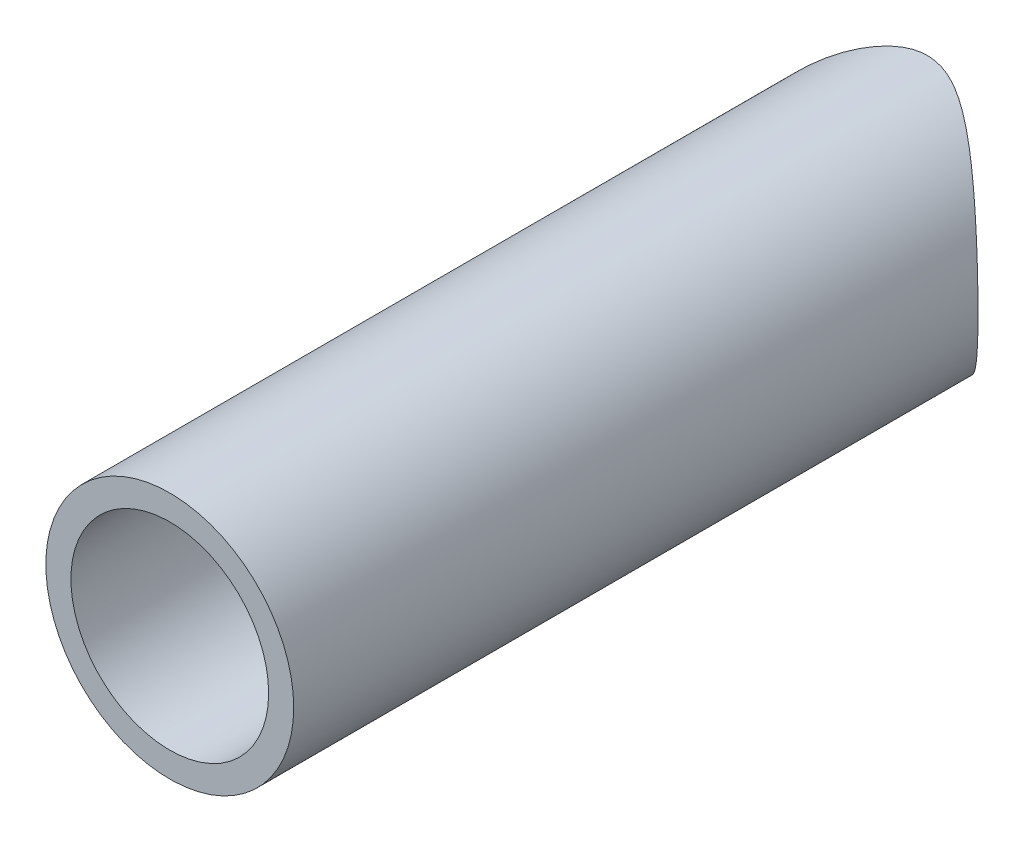
ISO-10303-21;
HEADER;
FILE_DESCRIPTION(('STEP AP214'),'2;1');
FILE_NAME('part.step','',(''),(''),'','','');
FILE_SCHEMA(('AUTOMOTIVE_DESIGN { 1 0 10303 214 1 1 1 1 }'));
ENDSEC;
DATA;
#1=APPLICATION_CONTEXT('core data for automotive mechanical design processes');
#2=APPLICATION_PROTOCOL_DEFINITION('international standard','automotive_design',2000,#1);
#3=PRODUCT_CONTEXT('',#1,'mechanical');
#4=PRODUCT('Part','Part','',(#3));
#5=PRODUCT_RELATED_PRODUCT_CATEGORY('part','',(#4));
#6=PRODUCT_DEFINITION_FORMATION('','',#4);
#7=PRODUCT_DEFINITION_CONTEXT('part definition',#1,'design');
#8=PRODUCT_DEFINITION('design','',#6,#7);
#9=PRODUCT_DEFINITION_SHAPE('','',#8);
#10=(LENGTH_UNIT() NAMED_UNIT(*) SI_UNIT(.MILLI.,.METRE.));
#11=(NAMED_UNIT(*) PLANE_ANGLE_UNIT() SI_UNIT($,.RADIAN.));
#12=(NAMED_UNIT(*) SI_UNIT($,.STERADIAN.) SOLID_ANGLE_UNIT());
#13=UNCERTAINTY_MEASURE_WITH_UNIT(LENGTH_MEASURE(1.E-05),#10,'distance_accuracy_value','');
#14=(GEOMETRIC_REPRESENTATION_CONTEXT(3) GLOBAL_UNCERTAINTY_ASSIGNED_CONTEXT((#13)) GLOBAL_UNIT_ASSIGNED_CONTEXT((#10,
#11,#12)) REPRESENTATION_CONTEXT('',''));
#15=CARTESIAN_POINT('',(0.,0.,0.));
#16=DIRECTION('',(0.,0.,1.));
#17=DIRECTION('',(1.,0.,0.));
#18=AXIS2_PLACEMENT_3D('',#15,#16,#17);
#19=CARTESIAN_POINT('',(-1.42108555E-13,0.,0.));
#20=DIRECTION('',(-1.,0.,0.));
#21=DIRECTION('',(0.,0.,1.));
#22=AXIS2_PLACEMENT_3D('',#19,#20,#21);
#23=CYLINDRICAL_SURFACE('',#22,19.05);
#24=CARTESIAN_POINT('',(0.,-16.7005,9.16492224462366));
#25=CARTESIAN_POINT('',(-0.267334143513812,-16.7004969713397,9.16493171258329));
#26=CARTESIAN_POINT('',(-0.534760521150864,-16.6940594806178,9.17668870782665));
#27=CARTESIAN_POINT('',(-1.06712538014874,-16.6685058090113,9.22301882354344));
#28=CARTESIAN_POINT('',(-1.33206190918598,-16.6493804040792,9.25760854319756));
#29=CARTESIAN_POINT('',(-1.85795059910665,-16.5989371757088,9.34775030823759));
#30=CARTESIAN_POINT('',(-2.11888827113559,-16.5675826196982,9.40336549198863));
#31=CARTESIAN_POINT('',(-2.63458598543975,-16.4934410116738,9.5328093194584));
#32=CARTESIAN_POINT('',(-2.88934310047885,-16.4506486534959,9.60664641536692));
#33=CARTESIAN_POINT('',(-3.50369164038948,-16.3330191299805,9.8057943483614));
#34=CARTESIAN_POINT('',(-3.85948704124683,-16.2523959333377,9.93938952452206));
#35=CARTESIAN_POINT('',(-4.5560548404136,-16.0710546260535,10.2300066984114));
#36=CARTESIAN_POINT('',(-4.89681770500833,-15.9703239806617,10.3870432937713));
#37=CARTESIAN_POINT('',(-5.56488891938311,-15.7500085594273,10.7181812721493));
#38=CARTESIAN_POINT('',(-5.89215445587848,-15.6303688552144,10.8923317934382));
#39=CARTESIAN_POINT('',(-6.53313217210747,-15.3734866020983,11.2519890768331));
#40=CARTESIAN_POINT('',(-6.84684566013471,-15.2362457574814,11.4374947385336));
#41=CARTESIAN_POINT('',(-7.39982875596399,-14.9740797599377,11.7777700314269));
#42=CARTESIAN_POINT('',(-7.64138221710308,-14.8522279894587,11.9312187254284));
#43=CARTESIAN_POINT('',(-8.1168032999471,-14.5978380581598,12.2411541370664));
#44=CARTESIAN_POINT('',(-8.35067014494468,-14.465298822051,12.39764115919));
#45=CARTESIAN_POINT('',(-9.04131486324777,-14.0516778671889,12.8696415721536));
#46=CARTESIAN_POINT('',(-9.48700758297317,-13.7546544723884,13.1876129782373));
#47=CARTESIAN_POINT('',(-10.3486324689901,-13.1186442693846,13.82045645139));
#48=CARTESIAN_POINT('',(-10.7645953899587,-12.7797018464993,14.1353314219882));
#49=CARTESIAN_POINT('',(-11.5659953881062,-12.0592094958907,14.7547790562651));
#50=CARTESIAN_POINT('',(-11.9514461873923,-11.6776789093992,15.0593563153826));
#51=CARTESIAN_POINT('',(-12.6037051376366,-10.9649221128724,15.5827057401072));
#52=CARTESIAN_POINT('',(-12.8773206259585,-10.6425001835016,15.8050176411876));
#53=CARTESIAN_POINT('',(-13.4031359250787,-9.9721646081207,16.2362931237103));
#54=CARTESIAN_POINT('',(-13.6553362938992,-9.62425162678145,16.4452570529308));
#55=CARTESIAN_POINT('',(-14.1356722307146,-8.90374466422381,16.8462336575498));
#56=CARTESIAN_POINT('',(-14.3638404428801,-8.53118531213244,17.0382692681927));
#57=CARTESIAN_POINT('',(-14.7937679756363,-7.76177857900515,17.4022494225294));
#58=CARTESIAN_POINT('',(-14.9955326569384,-7.36493615225123,17.5741980437234));
#59=CARTESIAN_POINT('',(-15.3345046593532,-6.62515786515105,17.8643971050048));
#60=CARTESIAN_POINT('',(-15.4767206347819,-6.286087835233,17.9866683996884));
#61=CARTESIAN_POINT('',(-15.7400317806347,-5.59419707966774,18.2137298076118));
#62=CARTESIAN_POINT('',(-15.8611312908755,-5.24137919773268,18.3185235126201));
#63=CARTESIAN_POINT('',(-16.0805178447426,-4.52375529099961,18.5088053133987));
#64=CARTESIAN_POINT('',(-16.1788127560741,-4.15895345046511,18.5943000671316));
#65=CARTESIAN_POINT('',(-16.3511008978489,-3.41940512301331,18.7443994459972));
#66=CARTESIAN_POINT('',(-16.4250938603572,-3.04465852650187,18.8090038408086));
#67=CARTESIAN_POINT('',(-16.5478177121131,-2.28581119925894,18.9162674839082));
#68=CARTESIAN_POINT('',(-16.5964102006374,-1.90167091887679,18.9588064940739));
#69=CARTESIAN_POINT('',(-16.666804707323,-1.12906083878382,19.0204597575691));
#70=CARTESIAN_POINT('',(-16.6886066647097,-0.74059102925346,19.0395739577594));
#71=CARTESIAN_POINT('',(-16.7049882251047,0.0372978163732662,19.0539343955931));
#72=CARTESIAN_POINT('',(-16.6995724752064,0.426716679082538,19.049184707706));
#73=CARTESIAN_POINT('',(-16.6616355145164,1.2031920509291,19.0159357772426));
#74=CARTESIAN_POINT('',(-16.6291157684196,1.59024868658218,18.9874378180186));
#75=CARTESIAN_POINT('',(-16.5415552070959,2.32567865984817,18.9108023421566));
#76=CARTESIAN_POINT('',(-16.488693223795,2.67451459724518,18.8645659111558));
#77=CARTESIAN_POINT('',(-16.3616909650143,3.36527510512395,18.7536602611724));
#78=CARTESIAN_POINT('',(-16.2875521815503,3.70720015842598,18.6889923346835));
#79=CARTESIAN_POINT('',(-16.1190414789457,4.38226758281246,18.5423185700096));
#80=CARTESIAN_POINT('',(-16.0246660698939,4.71540842787238,18.46030974133));
#81=CARTESIAN_POINT('',(-15.8169106363278,5.37125573153289,18.2802564782909));
#82=CARTESIAN_POINT('',(-15.7035294347893,5.69396154241695,18.182211050798));
#83=CARTESIAN_POINT('',(-15.450819750521,6.34903861621961,17.9643884341261));
#84=CARTESIAN_POINT('',(-15.3102569210811,6.68059356551892,17.8435914710632));
#85=CARTESIAN_POINT('',(-15.0105687207739,7.329200629877,17.5871249569696));
#86=CARTESIAN_POINT('',(-14.8514430464951,7.6462525077637,17.4514551628432));
#87=CARTESIAN_POINT('',(-14.5161859035024,8.26503816448766,17.1670489808401));
#88=CARTESIAN_POINT('',(-14.3400568632683,8.56677412143307,17.0183144591857));
#89=CARTESIAN_POINT('',(-13.9721688765162,9.15453154930369,16.7094978823359));
#90=CARTESIAN_POINT('',(-13.7804066955943,9.44054974772174,16.549413479815));
#91=CARTESIAN_POINT('',(-13.2797925036004,10.1401439624792,16.1344390292778));
#92=CARTESIAN_POINT('',(-12.9615928917062,10.5433589550976,15.8732639569844));
#93=CARTESIAN_POINT('',(-12.2957493768357,11.3128406850839,15.334371926415));
#94=CARTESIAN_POINT('',(-11.9480920605743,11.6790904225519,15.0566474497901));
#95=CARTESIAN_POINT('',(-11.2241657385922,12.3765383549121,14.4888552244966));
#96=CARTESIAN_POINT('',(-10.8477622427781,12.7075519462558,14.1987326557412));
#97=CARTESIAN_POINT('',(-10.0694893547772,13.3327127718377,13.6133980326449));
#98=CARTESIAN_POINT('',(-9.66762628498831,13.6268691052601,13.3181872550159));
#99=CARTESIAN_POINT('',(-8.82886911504135,14.1851175017329,12.7222327858003));
#100=CARTESIAN_POINT('',(-8.39137729391606,14.4483502704712,12.4215202757343));
#101=CARTESIAN_POINT('',(-7.71423447868457,14.8142868478741,11.978160080526));
#102=CARTESIAN_POINT('',(-7.4848946856878,14.9315074903397,11.8315739941533));
#103=CARTESIAN_POINT('',(-7.01897178437125,15.1561088727815,11.5424573570132));
#104=CARTESIAN_POINT('',(-6.78238972084811,15.263491023253,11.3999262269336));
#105=CARTESIAN_POINT('',(-6.3031860852116,15.467511398442,11.1215189175592));
#106=CARTESIAN_POINT('',(-6.06061486641165,15.5642160457498,10.9856049269084));
#107=CARTESIAN_POINT('',(-5.56747089335448,15.7473540612849,10.7214348860791));
#108=CARTESIAN_POINT('',(-5.31689704311532,15.8337860149196,10.5931798917832));
#109=CARTESIAN_POINT('',(-4.80783032456403,15.9957081213771,10.3470517951479));
#110=CARTESIAN_POINT('',(-4.54935285365322,16.0712180881296,10.2291600489364));
#111=CARTESIAN_POINT('',(-4.02385429135118,16.2107725612406,10.0065282200569));
#112=CARTESIAN_POINT('',(-3.75683726329165,16.2748224276667,9.90178199590471));
#113=CARTESIAN_POINT('',(-3.25302839587754,16.3823385341132,9.72269482971668));
#114=CARTESIAN_POINT('',(-3.017374342503,16.4274384650467,9.64614789023986));
#115=CARTESIAN_POINT('',(-2.54015715607399,16.5079626202915,9.50768607055383));
#116=CARTESIAN_POINT('',(-2.29859466535356,16.5433878913312,9.44576960753026));
#117=CARTESIAN_POINT('',(-1.81109459221824,16.6038179609703,9.33913774128664));
#118=CARTESIAN_POINT('',(-1.56517128179642,16.6288518871565,9.29437428459953));
#119=CARTESIAN_POINT('',(-1.06972288808643,16.6680568840186,9.22388336313559));
#120=CARTESIAN_POINT('',(-0.820197958666611,16.6822284173665,9.19815508757753));
#121=CARTESIAN_POINT('',(-0.317697960509029,16.6993832396358,9.16697500651445));
#122=CARTESIAN_POINT('',(-0.064710973856701,16.7022864368161,9.16166835365168));
#123=CARTESIAN_POINT('',(0.440691090104184,16.6965973761502,9.17203176520293));
#124=CARTESIAN_POINT('',(0.693106174235391,16.6880052561712,9.18770157803913));
#125=CARTESIAN_POINT('',(1.19569135625681,16.6595470554227,9.23920143813596));
#126=CARTESIAN_POINT('',(1.44585618089403,16.6396592471854,9.27507033758286));
#127=CARTESIAN_POINT('',(1.9417283857023,16.5891094904821,9.36517988059043));
#128=CARTESIAN_POINT('',(2.18743496046977,16.5584456152532,9.41942380954735));
#129=CARTESIAN_POINT('',(2.75390499349109,16.4751221377221,9.56462109831966));
#130=CARTESIAN_POINT('',(3.0724977792427,16.4185397230908,9.66178305936684));
#131=CARTESIAN_POINT('',(3.6984342588225,16.2889713478626,9.87865499878587));
#132=CARTESIAN_POINT('',(4.00577286211501,16.2159780682651,9.9983750338525));
#133=CARTESIAN_POINT('',(4.60990982401467,16.0547023351078,10.2553452780955));
#134=CARTESIAN_POINT('',(4.90667483105957,15.9663759154979,10.3926455912197));
#135=CARTESIAN_POINT('',(5.48919004687079,15.7755962103843,10.6800192987644));
#136=CARTESIAN_POINT('',(5.77494044142326,15.6731431632914,10.8300924776048));
#137=CARTESIAN_POINT('',(6.29917979834937,15.4691752125086,11.1190902170746));
#138=CARTESIAN_POINT('',(6.53894133190319,15.369309556088,11.2568846623541));
#139=CARTESIAN_POINT('',(7.01109564172073,15.1597470786916,11.5375598584046));
#140=CARTESIAN_POINT('',(7.2434873662306,15.0500488629716,11.6804413290297));
#141=CARTESIAN_POINT('',(7.93034916355095,14.706418450573,12.1144412707242));
#142=CARTESIAN_POINT('',(8.37434792805997,14.458012420242,12.4108257765464));
#143=CARTESIAN_POINT('',(9.23646923233411,13.9230714223544,13.0081451122874));
#144=CARTESIAN_POINT('',(9.65455508965203,13.6364841335111,13.3090856747979));
#145=CARTESIAN_POINT('',(10.4643689379054,13.0253930888848,13.9077161762095));
#146=CARTESIAN_POINT('',(10.8561033915344,12.7008986836573,14.2054068970222));
#147=CARTESIAN_POINT('',(11.6261157150575,12.0008618634111,14.8020628991056));
#148=CARTESIAN_POINT('',(12.0033666977648,11.6238795658078,15.1006713624391));
#149=CARTESIAN_POINT('',(12.7258044391788,10.8281781550468,15.681061925244));
#150=CARTESIAN_POINT('',(13.070983602633,10.4094492038662,15.9628400333343));
#151=CARTESIAN_POINT('',(13.724151830647,9.53165214803921,16.5019482957775));
#152=CARTESIAN_POINT('',(14.0322593223495,9.07272105460881,16.7593557096517));
#153=CARTESIAN_POINT('',(14.4633053136647,8.35448695148135,17.1224137504313));
#154=CARTESIAN_POINT('',(14.6017752870601,8.11015781906637,17.2395684455245));
#155=CARTESIAN_POINT('',(14.8677152846243,7.61167179592308,17.465389032482));
#156=CARTESIAN_POINT('',(14.9951829759962,7.3575128374535,17.5740531236363));
#157=CARTESIAN_POINT('',(15.2710980163437,6.76994194580124,17.8099923433337));
#158=CARTESIAN_POINT('',(15.4159255874011,6.43365007281853,17.9343776295871));
#159=CARTESIAN_POINT('',(15.6847682484996,5.74722197906865,18.1659874111414));
#160=CARTESIAN_POINT('',(15.8087895010181,5.39708989563437,18.2732169872342));
#161=CARTESIAN_POINT('',(16.0343443294884,4.68465742067921,18.4686987374566));
#162=CARTESIAN_POINT('',(16.1358889538978,4.32236310885614,18.5569602347818));
#163=CARTESIAN_POINT('',(16.315006660328,3.58751519829674,18.712918020525));
#164=CARTESIAN_POINT('',(16.3925788998939,3.21496123950949,18.7806135861987));
#165=CARTESIAN_POINT('',(16.5227859988325,2.4600329406762,18.8943707584114));
#166=CARTESIAN_POINT('',(16.5752782963087,2.07761518489369,18.9403086754329));
#167=CARTESIAN_POINT('',(16.6536928743376,1.30798312864007,19.0089696320617));
#168=CARTESIAN_POINT('',(16.6796152692096,0.920768848813674,19.0316927715525));
#169=CARTESIAN_POINT('',(16.7043812301211,0.144866523765919,19.0534017047831));
#170=CARTESIAN_POINT('',(16.703228891697,-0.243821289663468,19.0523910886768));
#171=CARTESIAN_POINT('',(16.673876335199,-1.01936819512169,19.0266628954678));
#172=CARTESIAN_POINT('',(16.6456775469154,-1.40622738273306,19.0019465715496));
#173=CARTESIAN_POINT('',(16.5662492256478,-2.14282170166587,18.9324082421113));
#174=CARTESIAN_POINT('',(16.5171347749374,-2.4929639539686,18.8894333762072));
#175=CARTESIAN_POINT('',(16.3974255377654,-3.1866945236683,18.7848480313874));
#176=CARTESIAN_POINT('',(16.3268321958921,-3.53028328017742,18.7232388057493));
#177=CARTESIAN_POINT('',(16.1651783563708,-4.208970642905,18.5824437203587));
#178=CARTESIAN_POINT('',(16.0741145606462,-4.54406787132817,18.5032550283336));
#179=CARTESIAN_POINT('',(15.8727288325233,-5.20406006253607,18.3285790529043));
#180=CARTESIAN_POINT('',(15.7624057607375,-5.52895442037182,18.2330908052185));
#181=CARTESIAN_POINT('',(15.5166116002092,-6.18643270750094,18.0210139635634));
#182=CARTESIAN_POINT('',(15.3800258596851,-6.51830064376362,17.903500731655));
#183=CARTESIAN_POINT('',(15.0882485289239,-7.16786232403991,17.6534809065475));
#184=CARTESIAN_POINT('',(14.9330567182975,-7.48555590009691,17.5209741357508));
#185=CARTESIAN_POINT('',(14.6055992998661,-8.10593542179799,17.2427339282642));
#186=CARTESIAN_POINT('',(14.433334858401,-8.40862239052236,17.0970013951676));
#187=CARTESIAN_POINT('',(14.073117885155,-8.99852996119753,16.794015807398));
#188=CARTESIAN_POINT('',(13.8851621005975,-9.28574733593744,16.6367603648848));
#189=CARTESIAN_POINT('',(13.3948553657084,-9.9874958280873,16.2293224719705));
#190=CARTESIAN_POINT('',(13.083213077385,-10.3919032356858,15.9727915114827));
#191=CARTESIAN_POINT('',(12.4305754806713,-11.1643811052831,15.4427556832551));
#192=CARTESIAN_POINT('',(12.0895669830621,-11.5324350788893,15.1692432041716));
#193=CARTESIAN_POINT('',(11.3793336820004,-12.2338752711684,14.6094823534446));
#194=CARTESIAN_POINT('',(11.0099897348343,-12.567099426554,14.3231825867058));
#195=CARTESIAN_POINT('',(10.2461250239018,-13.1973021064863,13.7446925323015));
#196=CARTESIAN_POINT('',(9.85161008828557,-13.4942889754515,13.4525036188645));
#197=CARTESIAN_POINT('',(9.02853185242813,-14.0586994442566,12.8618063908295));
#198=CARTESIAN_POINT('',(8.59939903498759,-14.3252991664271,12.5633051486633));
#199=CARTESIAN_POINT('',(7.7138226202617,-14.8209801943336,11.9745105441563));
#200=CARTESIAN_POINT('',(7.25735840874405,-15.0500326814112,11.6842236266356));
#201=CARTESIAN_POINT('',(6.55204064605885,-15.3636931423819,11.2645419394328));
#202=CARTESIAN_POINT('',(6.31414073695103,-15.4630411759273,11.1276074698839));
#203=CARTESIAN_POINT('',(5.83060990517612,-15.6517757583158,10.8605294940374));
#204=CARTESIAN_POINT('',(5.58497805823002,-15.741161110372,10.7303868046124));
#205=CARTESIAN_POINT('',(5.0860151658861,-15.9093792453499,10.4793584841729));
#206=CARTESIAN_POINT('',(4.83269714023912,-15.9882287709039,10.358458299818));
#207=CARTESIAN_POINT('',(4.3177229260104,-16.1349188587204,10.1284493823784));
#208=CARTESIAN_POINT('',(4.05607013110744,-16.202763834869,10.0193359275729));
#209=CARTESIAN_POINT('',(3.55088725229858,-16.3204855569409,9.82627788539519));
#210=CARTESIAN_POINT('',(3.3081672600192,-16.3714814235504,9.74090697898469));
#211=CARTESIAN_POINT('',(2.81604949033619,-16.4632680074043,9.58496246650375));
#212=CARTESIAN_POINT('',(2.56665131083892,-16.5040581086231,9.51438975370186));
#213=CARTESIAN_POINT('',(2.06294009009423,-16.57454049378,9.39106751249732));
#214=CARTESIAN_POINT('',(1.80864978682487,-16.6042750874025,9.33825011013253));
#215=CARTESIAN_POINT('',(1.29573530587421,-16.6521467637266,9.25261877015366));
#216=CARTESIAN_POINT('',(1.03711438199104,-16.6702921851168,9.21979045070778));
#217=CARTESIAN_POINT('',(0.648205600149655,-16.6884176100347,9.1869118266478));
#218=CARTESIAN_POINT('',(0.518770543150936,-16.6929438825602,9.1786799878668));
#219=CARTESIAN_POINT('',(0.259564292009351,-16.6989862187004,9.16768216137718));
#220=CARTESIAN_POINT('',(0.129793016652383,-16.7005014704405,9.16491764784816));
#221=CARTESIAN_POINT('',(0.,-16.7005,9.16492224462366));
#222=B_SPLINE_CURVE_WITH_KNOTS('',3,(#24,#25,#26,#27,#28,#29,#30,#31,#32,#33,#34,#35,#36,#37,
#38,#39,#40,#41,#42,#43,#44,#45,#46,#47,#48,#49,#50,#51,#52,#53,#54,#55,#56,#57,#58,#59,#60,#61,
#62,#63,#64,#65,#66,#67,#68,#69,#70,#71,#72,#73,#74,#75,#76,#77,#78,#79,#80,#81,#82,#83,#84,#85,
#86,#87,#88,#89,#90,#91,#92,#93,#94,#95,#96,#97,#98,#99,#100,#101,#102,#103,#104,#105,#106,#107,
#108,#109,#110,#111,#112,#113,#114,#115,#116,#117,#118,#119,#120,#121,#122,#123,#124,#125,#126,
#127,#128,#129,#130,#131,#132,#133,#134,#135,#136,#137,#138,#139,#140,#141,#142,#143,#144,#145,
#146,#147,#148,#149,#150,#151,#152,#153,#154,#155,#156,#157,#158,#159,#160,#161,#162,#163,#164,
#165,#166,#167,#168,#169,#170,#171,#172,#173,#174,#175,#176,#177,#178,#179,#180,#181,#182,#183,
#184,#185,#186,#187,#188,#189,#190,#191,#192,#193,#194,#195,#196,#197,#198,#199,#200,#201,#202,
#203,#204,#205,#206,#207,#208,#209,#210,#211,#212,#213,#214,#215,#216,#217,#218,#219,#220,#221),
.UNSPECIFIED.,.T.,.F.,(4,2,2,2,2,2,2,2,2,2,2,2,2,2,2,2,2,2,2,2,2,2,2,2,2,2,2,2,2,2,2,2,2,2,2,2,
2,2,2,2,2,2,2,2,2,2,2,2,2,2,2,2,2,2,2,2,2,2,2,2,2,2,2,2,2,2,2,2,2,2,2,2,2,2,2,2,2,2,2,2,2,2,2,2,
2,2,2,2,2,2,2,2,2,2,2,2,2,2,4),(0.,0.801837429596003,1.60425843057712,2.40910845045848,
3.21433250208412,4.37787474462989,5.54214460393507,6.70986087456664,7.87746416261185,
8.81026563612272,9.74316107818136,11.6094445513692,13.4737685905699,15.3372493735002,
16.7692951064365,18.2013035125269,19.631340953316,21.0610876015194,22.2224283636906,
23.3835301672392,24.5442307869359,25.7049442032107,26.8719178064824,28.0388940570331,
29.2056710673079,30.3723850292556,31.4386991828291,32.5049385803792,33.5713620045441,
34.6378514964658,35.7762787737258,36.9147246612977,38.0530081919524,39.1915278273071,
40.9177055603248,42.6446735598335,44.380284856342,46.115466823728,47.8910429391808,
48.7798793209016,49.6685880745535,50.5514132177893,51.4343597891945,52.3156839296451,
53.1965947773504,53.9515400178129,54.7064035462523,55.4591366186985,56.2118376275152,
56.9698789023383,57.7279110857986,58.4874063204878,59.2470374222229,60.2589246426935,
61.2712640481267,62.2865556726081,63.3018301644174,64.1835582212893,65.0654115494357,
66.8296916847058,68.5964148393902,70.3627031127071,72.1940401696108,74.0258098244316,
75.8515630299742,76.7640514971158,77.6767329649309,78.8356836946879,79.9942905546169,
81.1523266266567,82.3104033906068,83.4749869192756,84.6395654372018,85.8039677929887,
86.9683085969112,88.0356197984032,89.1028592324735,90.1702707371519,91.2377454117945,
92.369532140314,93.5013322761842,94.6330551448101,95.7650132021125,97.4766425845455,
99.1890447593569,100.909089839066,102.628738090723,104.387412653646,106.147430796405,
107.022914163103,107.898502585883,108.772682617086,109.646511146036,110.432807968525,
111.219152240871,112.002455399937,112.785194316669,113.174388331415,113.563687271999),.UNSPECIFIED.);
#223=CARTESIAN_POINT('',(0.,-16.7005,9.16492224462366));
#224=VERTEX_POINT('',#223);
#225=EDGE_CURVE('E28',#224,#224,#222,.F.);
#226=ORIENTED_EDGE('',*,*,#225,.F.);
#227=EDGE_LOOP('',(#226));
#228=FACE_BOUND('',#227,.T.);
#229=CARTESIAN_POINT('',(0.,-13.3223,13.6168580337021));
#230=CARTESIAN_POINT('',(0.31988652633806,-13.3222981478097,13.6168614502072));
#231=CARTESIAN_POINT('',(0.639797242992395,-13.3107525824012,13.628184894002));
#232=CARTESIAN_POINT('',(1.27642617969916,-13.2648527158155,13.6728627603449));
#233=CARTESIAN_POINT('',(1.59314397347371,-13.2304954089984,13.7062200860405));
#234=CARTESIAN_POINT('',(2.221130035707,-13.139677578582,13.7933067556177));
#235=CARTESIAN_POINT('',(2.53238675830178,-13.0831750230616,13.8470748331872));
#236=CARTESIAN_POINT('',(3.14662661666113,-12.94918015756,13.9724593784829));
#237=CARTESIAN_POINT('',(3.44960942648851,-12.8716870219986,14.0440765482227));
#238=CARTESIAN_POINT('',(4.04231678109167,-12.6979387684118,14.2013520959915));
#239=CARTESIAN_POINT('',(4.33215378434118,-12.6019098508723,14.2868393842577));
#240=CARTESIAN_POINT('',(4.90141144157906,-12.3916089572922,14.4696210652096));
#241=CARTESIAN_POINT('',(5.18082714154018,-12.2773284378767,14.5669209821165));
#242=CARTESIAN_POINT('',(5.72846372178175,-12.0315605128677,14.770562174833));
#243=CARTESIAN_POINT('',(5.9966867691101,-11.9000764586881,14.8769016882326));
#244=CARTESIAN_POINT('',(6.52154726452771,-11.6207340257021,15.0961107423294));
#245=CARTESIAN_POINT('',(6.77818782989793,-11.4728800900869,15.2089785071446));
#246=CARTESIAN_POINT('',(7.32357994083547,-11.1341436928368,15.4591420166459));
#247=CARTESIAN_POINT('',(7.61009442573397,-10.9402587925397,15.5972569013245));
#248=CARTESIAN_POINT('',(8.16639702208179,-10.5315139977905,15.8761123693525));
#249=CARTESIAN_POINT('',(8.43618388684849,-10.3166525430546,16.0168531473911));
#250=CARTESIAN_POINT('',(8.9587266433862,-9.86630553881672,16.2981310418589));
#251=CARTESIAN_POINT('',(9.21146225460457,-9.63079617033312,16.4386677277965));
#252=CARTESIAN_POINT('',(9.69874022973578,-9.13989777428,16.7165890023536));
#253=CARTESIAN_POINT('',(9.93328134055978,-8.88450737989011,16.8539733734094));
#254=CARTESIAN_POINT('',(10.420547416895,-8.31025065919657,17.1453314675352));
#255=CARTESIAN_POINT('',(10.6698050648036,-7.98789304111428,17.2982621580168));
#256=CARTESIAN_POINT('',(11.1400000535633,-7.31789376821127,17.5921790852614));
#257=CARTESIAN_POINT('',(11.3609321889448,-6.9702474843583,17.7331631249407));
#258=CARTESIAN_POINT('',(11.7715183015944,-6.25187201135312,17.9989730615405));
#259=CARTESIAN_POINT('',(11.9612225135273,-5.88118124283975,18.1238248385623));
#260=CARTESIAN_POINT('',(12.3068591127191,-5.11858800434073,18.3537720761174));
#261=CARTESIAN_POINT('',(12.4628061664871,-4.72669483906192,18.4588761138412));
#262=CARTESIAN_POINT('',(12.7010421193985,-4.03277849284508,18.6206841141411));
#263=CARTESIAN_POINT('',(12.7918624757773,-3.73491559390011,18.682803774284));
#264=CARTESIAN_POINT('',(12.9528661082313,-3.13120844518833,18.7934065558681));
#265=CARTESIAN_POINT('',(13.0230537383409,-2.82536589418578,18.8418925542676));
#266=CARTESIAN_POINT('',(13.14185187519,-2.20776667348627,18.9241977467945));
#267=CARTESIAN_POINT('',(13.1904758409694,-1.89601381980445,18.9580260892478));
#268=CARTESIAN_POINT('',(13.2655302565148,-1.26854784484051,19.0103232226469));
#269=CARTESIAN_POINT('',(13.2919599533497,-0.952834589572198,19.0287914925086));
#270=CARTESIAN_POINT('',(13.3222597332972,-0.31917956235475,19.0499687337098));
#271=CARTESIAN_POINT('',(13.326085857239,-0.00123465114232492,19.0526469968036));
#272=CARTESIAN_POINT('',(13.3110031436808,0.633847263309006,19.0421006894973));
#273=CARTESIAN_POINT('',(13.2920943914738,0.950984269574409,19.0288761787587));
#274=CARTESIAN_POINT('',(13.2318194226826,1.58213735553395,18.9868218272433));
#275=CARTESIAN_POINT('',(13.1904479713798,1.89615269037562,18.9579883489496));
#276=CARTESIAN_POINT('',(13.0858409365783,2.51874825818788,18.8853551821731));
#277=CARTESIAN_POINT('',(13.0226053344318,2.82732848652267,18.8415554809257));
#278=CARTESIAN_POINT('',(12.8768055570558,3.43008911577336,18.7410837784494));
#279=CARTESIAN_POINT('',(12.7947148536454,3.72443741904168,18.6847279728804));
#280=CARTESIAN_POINT('',(12.6114314596894,4.30441297595258,18.5597019641527));
#281=CARTESIAN_POINT('',(12.5102391907176,4.59004042190389,18.4910320327698));
#282=CARTESIAN_POINT('',(12.2897976043466,5.1512574450488,18.3426090562162));
#283=CARTESIAN_POINT('',(12.1705477348143,5.42684671499319,18.2628556721614));
#284=CARTESIAN_POINT('',(11.9150543034258,5.96694473566732,18.0935951500125));
#285=CARTESIAN_POINT('',(11.7788084781244,6.23145200426643,18.004086712985));
#286=CARTESIAN_POINT('',(11.4741859851383,6.77754721148407,17.8062035536039));
#287=CARTESIAN_POINT('',(11.3039194358879,7.05772235950273,17.6968388241989));
#288=CARTESIAN_POINT('',(10.944991629307,7.60245040810987,17.4697551881095));
#289=CARTESIAN_POINT('',(10.7563292067023,7.86700231734827,17.3520357523306));
#290=CARTESIAN_POINT('',(10.3616001265381,8.38008264984337,17.1101497579331));
#291=CARTESIAN_POINT('',(10.1555176216586,8.62859611231162,16.9859773693862));
#292=CARTESIAN_POINT('',(9.72707743344,9.10885362089824,16.7333476085061));
#293=CARTESIAN_POINT('',(9.5047183828671,9.34059625500394,16.6048898766973));
#294=CARTESIAN_POINT('',(9.00346439264899,9.82669756532139,16.3227118379899));
#295=CARTESIAN_POINT('',(8.72155934818149,10.0777180759097,16.1685721297418));
#296=CARTESIAN_POINT('',(8.13720269984174,10.5551889267503,15.860994658355));
#297=CARTESIAN_POINT('',(7.83474698021703,10.7816343215371,15.707557042433));
#298=CARTESIAN_POINT('',(7.21007593059627,11.2090003382942,15.4054946764291));
#299=CARTESIAN_POINT('',(6.88786284250592,11.4099238483628,15.2568693831976));
#300=CARTESIAN_POINT('',(6.22428542965587,11.78503846859,14.9690089852482));
#301=CARTESIAN_POINT('',(5.88292675135433,11.9592374043918,14.8297711383645));
#302=CARTESIAN_POINT('',(5.26307548585057,12.2421949467986,14.5964580040423));
#303=CARTESIAN_POINT('',(4.98835083038973,12.3567629109929,14.4993951864827));
#304=CARTESIAN_POINT('',(4.42859477658522,12.5682414944608,14.3164711963064));
#305=CARTESIAN_POINT('',(4.14356603439826,12.6651566258766,14.2306071628288));
#306=CARTESIAN_POINT('',(3.564456481461,12.8401584734866,14.0729067823872));
#307=CARTESIAN_POINT('',(3.27038997523824,12.9182733734509,14.0010494688273));
#308=CARTESIAN_POINT('',(2.67414582363414,13.0547357571211,13.87389979944));
#309=CARTESIAN_POINT('',(2.37196827122568,13.1130834673041,13.8186072538271));
#310=CARTESIAN_POINT('',(1.75828452487774,13.2094492865481,13.7265242677556));
#311=CARTESIAN_POINT('',(1.44671418662299,13.2472509936074,13.6899310102396));
#312=CARTESIAN_POINT('',(0.819905882256556,13.3007648009045,13.6379459191976));
#313=CARTESIAN_POINT('',(0.504668046343509,13.3164776829125,13.6225533353354));
#314=CARTESIAN_POINT('',(-0.126344914354952,13.3254363019074,13.6137903844871));
#315=CARTESIAN_POINT('',(-0.442119859527984,13.3186884682998,13.6204137154194));
#316=CARTESIAN_POINT('',(-1.07117640732708,13.2829025286525,13.6553146237379));
#317=CARTESIAN_POINT('',(-1.38445811269697,13.2538653459899,13.6835913040944));
#318=CARTESIAN_POINT('',(-1.96259612856432,13.1797080711553,13.754999611617));
#319=CARTESIAN_POINT('',(-2.22814427169565,13.1373760024855,13.7955280874475));
#320=CARTESIAN_POINT('',(-2.75394668833031,13.0372964660328,13.8901454855898));
#321=CARTESIAN_POINT('',(-3.01419902789,12.9795434717645,13.9442392689549));
#322=CARTESIAN_POINT('',(-3.52833131241545,12.849316471082,14.064330741592));
#323=CARTESIAN_POINT('',(-3.78220742405787,12.7768338366348,14.1303354052306));
#324=CARTESIAN_POINT('',(-4.28267719245013,12.6178968233818,14.2724400702245));
#325=CARTESIAN_POINT('',(-4.52926912728759,12.531439171781,14.3485424356008));
#326=CARTESIAN_POINT('',(-5.12885946301222,12.3014064883293,14.546839514453));
#327=CARTESIAN_POINT('',(-5.47731633977133,12.1501002866724,14.6738702927616));
#328=CARTESIAN_POINT('',(-6.15625428401588,11.8206056641701,14.9405730792039));
#329=CARTESIAN_POINT('',(-6.48672807120731,11.642406464486,15.080250147008));
#330=CARTESIAN_POINT('',(-7.12952942608352,11.2602624030576,15.3677014900798));
#331=CARTESIAN_POINT('',(-7.44182626542754,11.0562756934435,15.5154887007473));
#332=CARTESIAN_POINT('',(-8.04706937031913,10.6238723952442,15.8147072588469));
#333=CARTESIAN_POINT('',(-8.34001786540576,10.3954586293985,15.9661381836551));
#334=CARTESIAN_POINT('',(-8.91119855456929,9.9104589642748,16.2717237055127));
#335=CARTESIAN_POINT('',(-9.18905171047002,9.65342504933495,16.4258761204329));
#336=CARTESIAN_POINT('',(-9.72292999884347,9.11547627667314,16.7303954283831));
#337=CARTESIAN_POINT('',(-9.97895352424027,8.83455966376557,16.8807620421328));
#338=CARTESIAN_POINT('',(-10.4674069986125,8.24996698451183,17.1740312969632));
#339=CARTESIAN_POINT('',(-10.6998671383029,7.94632093076941,17.3169433722024));
#340=CARTESIAN_POINT('',(-11.1397523547335,7.31689398561751,17.5921424141232));
#341=CARTESIAN_POINT('',(-11.3471821958347,6.99111732514065,17.7244314012347));
#342=CARTESIAN_POINT('',(-11.7035635394989,6.37307961126929,17.9548565597905));
#343=CARTESIAN_POINT('',(-11.8565482817566,6.08390928578376,18.0550572371503));
#344=CARTESIAN_POINT('',(-12.1420544799472,5.49200427038381,18.2438163728699));
#345=CARTESIAN_POINT('',(-12.2745796486065,5.18927205439218,18.3323769430842));
#346=CARTESIAN_POINT('',(-12.5177114364802,4.57172235927505,18.4960494161925));
#347=CARTESIAN_POINT('',(-12.6283263045408,4.25690948179752,18.5711663793386));
#348=CARTESIAN_POINT('',(-12.8263045389288,3.61687472801195,18.7063539542002));
#349=CARTESIAN_POINT('',(-12.9136677009799,3.29165276028368,18.7664244337257));
#350=CARTESIAN_POINT('',(-13.0643211461352,2.63108379342539,18.8704085260164));
#351=CARTESIAN_POINT('',(-13.1274686559158,2.29568895599008,18.914226265938));
#352=CARTESIAN_POINT('',(-13.2279537616266,1.61920802259463,18.9841059090691));
#353=CARTESIAN_POINT('',(-13.2652912643163,1.27812190607884,19.0101677481339));
#354=CARTESIAN_POINT('',(-13.3135081283688,0.593276512390129,19.0438447607636));
#355=CARTESIAN_POINT('',(-13.3243955305817,0.249518079491612,19.0514655404213));
#356=CARTESIAN_POINT('',(-13.3195399106919,-0.437702468361702,19.0480697144771));
#357=CARTESIAN_POINT('',(-13.3037988704554,-0.781164603465462,19.0370544958905));
#358=CARTESIAN_POINT('',(-13.2487621004555,-1.4318191437695,18.9986363504112));
#359=CARTESIAN_POINT('',(-13.2118800746207,-1.73931982577068,18.9729133006585));
#360=CARTESIAN_POINT('',(-13.1171241533884,-2.3494752929804,18.9070517795627));
#361=CARTESIAN_POINT('',(-13.0592518573326,-2.65213044555731,18.8669144065131));
#362=CARTESIAN_POINT('',(-12.9232619136269,-3.25072372146487,18.7730419258362));
#363=CARTESIAN_POINT('',(-12.8451419595202,-3.5466610753762,18.7193052691));
#364=CARTESIAN_POINT('',(-12.6695895749094,-4.13013408193948,18.5992801289864));
#365=CARTESIAN_POINT('',(-12.5721561934206,-4.41766932007471,18.5329910275394));
#366=CARTESIAN_POINT('',(-12.3552360964713,-4.99295965597184,18.3865183049275));
#367=CARTESIAN_POINT('',(-12.2350902182955,-5.28036144537957,18.3059255399387));
#368=CARTESIAN_POINT('',(-11.9763996770549,-5.84341786777716,18.1340461092357));
#369=CARTESIAN_POINT('',(-11.8378548035795,-6.11907236637754,18.0427593212263));
#370=CARTESIAN_POINT('',(-11.5435308675317,-6.65768439245888,17.8510352229444));
#371=CARTESIAN_POINT('',(-11.3877516514367,-6.92064180680491,17.7505978311603));
#372=CARTESIAN_POINT('',(-11.0600322428286,-7.43316282479309,17.5421534444722));
#373=CARTESIAN_POINT('',(-10.8880898362612,-7.68272458610459,17.4341454130494));
#374=CARTESIAN_POINT('',(-10.5009306315001,-8.20584810428199,17.1948163671598));
#375=CARTESIAN_POINT('',(-10.2831519189372,-8.47705727324643,17.0624915052235));
#376=CARTESIAN_POINT('',(-9.82857579459108,-9.00015982623114,16.792447314127));
#377=CARTESIAN_POINT('',(-9.59177667779294,-9.25205147463747,16.6547275019243));
#378=CARTESIAN_POINT('',(-9.09969376671602,-9.73646195503194,16.3762633702286));
#379=CARTESIAN_POINT('',(-8.84437372726345,-9.96894077456836,16.2355135211612));
#380=CARTESIAN_POINT('',(-8.31646063019951,-10.4134161381595,15.9540737188968));
#381=CARTESIAN_POINT('',(-8.04386707654831,-10.6254120935704,15.8133837675365));
#382=CARTESIAN_POINT('',(-7.43791773960602,-11.0598822099201,15.5132737254457));
#383=CARTESIAN_POINT('',(-7.10173450300473,-11.2787916719643,15.35437374504));
#384=CARTESIAN_POINT('',(-6.4076285571702,-11.6870921316281,15.0459252865087));
#385=CARTESIAN_POINT('',(-6.04969974049425,-11.8764747826172,14.8963794597405));
#386=CARTESIAN_POINT('',(-5.31391396465425,-12.2233798589468,14.6130598190104));
#387=CARTESIAN_POINT('',(-4.93610959902297,-12.380981513905,14.479247139033));
#388=CARTESIAN_POINT('',(-4.16128048578766,-12.6624248669813,14.2337777233722));
#389=CARTESIAN_POINT('',(-3.76426939092217,-12.7862901425106,14.1221055292494));
#390=CARTESIAN_POINT('',(-3.0895378129606,-12.9621009405296,13.9604989017828));
#391=CARTESIAN_POINT('',(-2.81638931470001,-13.0242403244649,13.9024129279701));
#392=CARTESIAN_POINT('',(-2.26405882422233,-13.131519192153,13.8011291579386));
#393=CARTESIAN_POINT('',(-1.98487812432129,-13.1766622796836,13.7579282057672));
#394=CARTESIAN_POINT('',(-1.42256759589598,-13.2491588624131,13.6881275567045));
#395=CARTESIAN_POINT('',(-1.13944427064924,-13.2765387611748,13.6615032223794));
#396=CARTESIAN_POINT('',(-0.570887195609121,-13.3131110190884,13.6258661011151));
#397=CARTESIAN_POINT('',(-0.285453229208018,-13.3223016528165,13.6168549849572));
#398=CARTESIAN_POINT('',(0.,-13.3223,13.6168580337021));
#399=B_SPLINE_CURVE_WITH_KNOTS('',3,(#229,#230,#231,#232,#233,#234,#235,#236,#237,#238,#239,
#240,#241,#242,#243,#244,#245,#246,#247,#248,#249,#250,#251,#252,#253,#254,#255,#256,#257,#258,
#259,#260,#261,#262,#263,#264,#265,#266,#267,#268,#269,#270,#271,#272,#273,#274,#275,#276,#277,
#278,#279,#280,#281,#282,#283,#284,#285,#286,#287,#288,#289,#290,#291,#292,#293,#294,#295,#296,
#297,#298,#299,#300,#301,#302,#303,#304,#305,#306,#307,#308,#309,#310,#311,#312,#313,#314,#315,
#316,#317,#318,#319,#320,#321,#322,#323,#324,#325,#326,#327,#328,#329,#330,#331,#332,#333,#334,
#335,#336,#337,#338,#339,#340,#341,#342,#343,#344,#345,#346,#347,#348,#349,#350,#351,#352,#353,
#354,#355,#356,#357,#358,#359,#360,#361,#362,#363,#364,#365,#366,#367,#368,#369,#370,#371,#372,
#373,#374,#375,#376,#377,#378,#379,#380,#381,#382,#383,#384,#385,#386,#387,#388,#389,#390,#391,
#392,#393,#394,#395,#396,#397,#398),.UNSPECIFIED.,.T.,.F.,(4,2,2,2,2,2,2,2,2,2,2,2,2,2,2,2,2,2,
2,2,2,2,2,2,2,2,2,2,2,2,2,2,2,2,2,2,2,2,2,2,2,2,2,2,2,2,2,2,2,2,2,2,2,2,2,2,2,2,2,2,2,2,2,2,2,2,
2,2,2,2,2,2,2,2,2,2,2,2,2,2,2,2,2,2,4),(0.,0.959302409132809,1.91873123956221,2.87998996416874,
3.8412865015179,4.79151927512173,5.74219815300106,6.69269210447255,7.64292869789224,
8.75940506370695,9.87596453893735,10.9938294406712,12.1117712635982,13.4157182811484,
14.7199045867601,16.0219719712897,17.3234725046702,18.2751113332229,19.2265491971759,
20.1773923790365,21.1282678165382,22.080991898562,23.0337124063162,23.9866550318807,
24.939598470204,25.8708187469832,26.8020184740265,27.7332466793874,28.6645990342079,
29.7004359496209,30.7363385221055,31.7731938278435,32.810136329847,34.0320227006545,
35.2541545081648,36.4761478937977,37.6977827624878,38.6362597465213,39.574496514028,
40.511317868205,41.4481284886485,42.3946238015175,43.3410856150811,44.2872765261706,
45.2334282416861,46.0483990618889,46.8636623407598,47.6794045518664,48.4953380783271,
49.6952829114323,50.8957099716212,52.0981107069435,53.3003726451946,54.5251825061162,
55.7500824586205,56.9733926190758,58.1964695615479,59.2219085876425,60.2471613116572,
61.2720273091769,62.2969023102901,63.327730236125,64.3585618858883,65.3890801228372,
66.4195216651222,67.3507545622815,68.2819165195771,69.2131845943019,70.1444985356485,
71.1088162917768,72.0731450767795,73.0374824526635,74.0019521177297,75.1172945720859,
76.2327371190752,77.3504247381143,78.4681444681092,79.7610327753561,81.0542858958521,
82.3442739715066,83.6333581837177,84.4907770112984,85.348013935167,86.2039737074804,
87.0600146717835),.UNSPECIFIED.);
#400=CARTESIAN_POINT('',(0.,-13.3223,13.6168580337021));
#401=VERTEX_POINT('',#400);
#402=EDGE_CURVE('E9',#401,#401,#399,.F.);
#403=ORIENTED_EDGE('',*,*,#402,.F.);
#404=EDGE_LOOP('',(#403));
#405=FACE_BOUND('',#404,.T.);
#406=ADVANCED_FACE('F14',(#228,#405),#23,.F.);
#407=CARTESIAN_POINT('',(0.,0.,0.));
#408=DIRECTION('',(0.,0.,1.));
#409=DIRECTION('',(1.,0.,0.));
#410=AXIS2_PLACEMENT_3D('',#407,#408,#409);
#411=CYLINDRICAL_SURFACE('',#410,13.3223);
#412=ORIENTED_EDGE('',*,*,#402,.T.);
#413=EDGE_LOOP('',(#412));
#414=FACE_BOUND('',#413,.T.);
#415=CARTESIAN_POINT('',(0.,0.,111.252));
#416=DIRECTION('',(0.,0.,1.));
#417=DIRECTION('',(1.,0.,0.));
#418=AXIS2_PLACEMENT_3D('',#415,#416,#417);
#419=CIRCLE('',#418,13.3223);
#420=CARTESIAN_POINT('',(13.3223,0.,111.252));
#421=VERTEX_POINT('',#420);
#422=EDGE_CURVE('E23',#421,#421,#419,.T.);
#423=ORIENTED_EDGE('',*,*,#422,.T.);
#424=EDGE_LOOP('',(#423));
#425=FACE_BOUND('',#424,.T.);
#426=ADVANCED_FACE('F34',(#414,#425),#411,.F.);
#427=CARTESIAN_POINT('',(0.,0.,0.));
#428=DIRECTION('',(0.,0.,1.));
#429=DIRECTION('',(1.,0.,0.));
#430=AXIS2_PLACEMENT_3D('',#427,#428,#429);
#431=CYLINDRICAL_SURFACE('',#430,16.7005);
#432=ORIENTED_EDGE('',*,*,#225,.T.);
#433=EDGE_LOOP('',(#432));
#434=FACE_BOUND('',#433,.T.);
#435=CARTESIAN_POINT('',(0.,0.,111.252));
#436=DIRECTION('',(0.,0.,1.));
#437=DIRECTION('',(1.,0.,0.));
#438=AXIS2_PLACEMENT_3D('',#435,#436,#437);
#439=CIRCLE('',#438,16.7005);
#440=CARTESIAN_POINT('',(16.7005,0.,111.252));
#441=VERTEX_POINT('',#440);
#442=EDGE_CURVE('E19',#441,#441,#439,.F.);
#443=ORIENTED_EDGE('',*,*,#442,.T.);
#444=EDGE_LOOP('',(#443));
#445=FACE_BOUND('',#444,.T.);
#446=ADVANCED_FACE('F16',(#434,#445),#431,.T.);
#447=CARTESIAN_POINT('',(0.,0.,111.252));
#448=DIRECTION('',(0.,0.,1.));
#449=DIRECTION('',(1.,0.,0.));
#450=AXIS2_PLACEMENT_3D('',#447,#448,#449);
#451=PLANE('',#450);
#452=ORIENTED_EDGE('',*,*,#442,.F.);
#453=EDGE_LOOP('',(#452));
#454=FACE_BOUND('',#453,.T.);
#455=ORIENTED_EDGE('',*,*,#422,.F.);
#456=EDGE_LOOP('',(#455));
#457=FACE_BOUND('',#456,.T.);
#458=ADVANCED_FACE('F38',(#454,#457),#451,.T.);
#459=CLOSED_SHELL('',(#406,#426,#446,#458));
#460=MANIFOLD_SOLID_BREP('B1',#459);
#461=ADVANCED_BREP_SHAPE_REPRESENTATION('',(#18,#460),#14);
#462=SHAPE_DEFINITION_REPRESENTATION(#9,#461);
ENDSEC;
END-ISO-10303-21;
